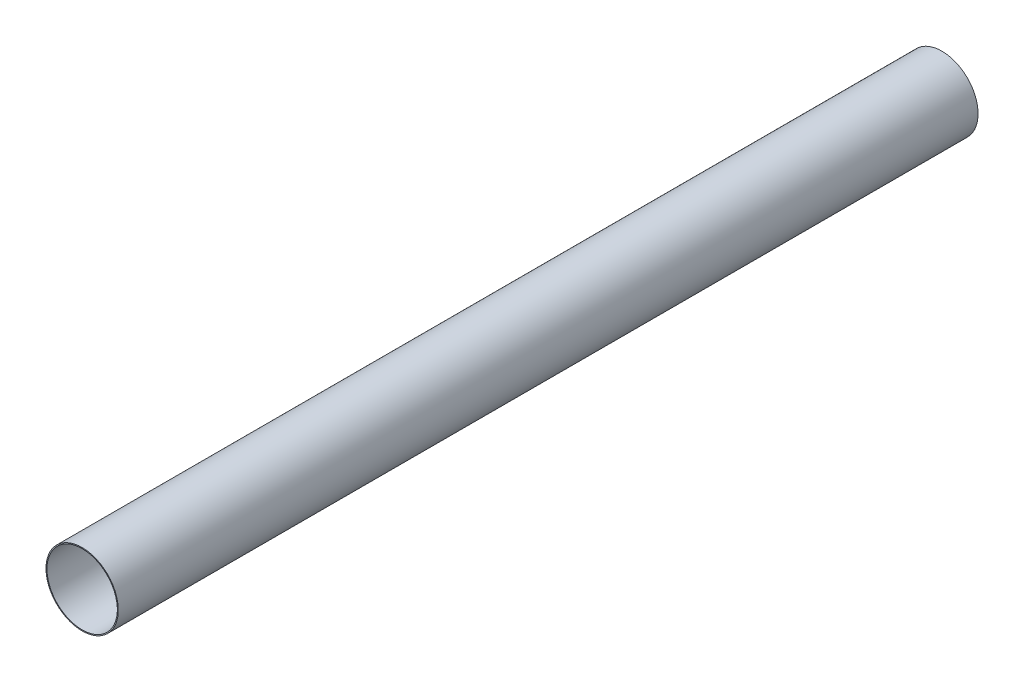
ISO-10303-21;
HEADER;
FILE_DESCRIPTION(('STEP AP214'),'2;1');
FILE_NAME('part.step','',(''),(''),'','','');
FILE_SCHEMA(('AUTOMOTIVE_DESIGN { 1 0 10303 214 1 1 1 1 }'));
ENDSEC;
DATA;
#1=APPLICATION_CONTEXT('core data for automotive mechanical design processes');
#2=APPLICATION_PROTOCOL_DEFINITION('international standard','automotive_design',2000,#1);
#3=PRODUCT_CONTEXT('',#1,'mechanical');
#4=PRODUCT('Part','Part','',(#3));
#5=PRODUCT_RELATED_PRODUCT_CATEGORY('part','',(#4));
#6=PRODUCT_DEFINITION_FORMATION('','',#4);
#7=PRODUCT_DEFINITION_CONTEXT('part definition',#1,'design');
#8=PRODUCT_DEFINITION('design','',#6,#7);
#9=PRODUCT_DEFINITION_SHAPE('','',#8);
#10=(LENGTH_UNIT() NAMED_UNIT(*) SI_UNIT(.MILLI.,.METRE.));
#11=(NAMED_UNIT(*) PLANE_ANGLE_UNIT() SI_UNIT($,.RADIAN.));
#12=(NAMED_UNIT(*) SI_UNIT($,.STERADIAN.) SOLID_ANGLE_UNIT());
#13=UNCERTAINTY_MEASURE_WITH_UNIT(LENGTH_MEASURE(1.E-05),#10,'distance_accuracy_value','');
#14=(GEOMETRIC_REPRESENTATION_CONTEXT(3) GLOBAL_UNCERTAINTY_ASSIGNED_CONTEXT((#13)) GLOBAL_UNIT_ASSIGNED_CONTEXT((#10,
#11,#12)) REPRESENTATION_CONTEXT('',''));
#15=CARTESIAN_POINT('',(0.,0.,0.));
#16=DIRECTION('',(0.,0.,1.));
#17=DIRECTION('',(1.,0.,0.));
#18=AXIS2_PLACEMENT_3D('',#15,#16,#17);
#19=CARTESIAN_POINT('',(0.,0.,1784.));
#20=DIRECTION('',(0.,0.,1.));
#21=DIRECTION('',(1.,0.,0.));
#22=AXIS2_PLACEMENT_3D('',#19,#20,#21);
#23=PLANE('',#22);
#24=CARTESIAN_POINT('',(0.,0.,1784.));
#25=DIRECTION('',(0.,0.,1.));
#26=DIRECTION('',(1.,0.,0.));
#27=AXIS2_PLACEMENT_3D('',#24,#25,#26);
#28=CIRCLE('',#27,75.);
#29=CARTESIAN_POINT('',(-75.,0.,1784.));
#30=VERTEX_POINT('',#29);
#31=EDGE_CURVE('E10',#30,#30,#28,.T.);
#32=ORIENTED_EDGE('',*,*,#31,.T.);
#33=EDGE_LOOP('',(#32));
#34=FACE_BOUND('',#33,.T.);
#35=CARTESIAN_POINT('',(0.,0.,1784.));
#36=DIRECTION('',(0.,0.,1.));
#37=DIRECTION('',(1.,0.,0.));
#38=AXIS2_PLACEMENT_3D('',#35,#36,#37);
#39=CIRCLE('',#38,73.);
#40=CARTESIAN_POINT('',(-73.,0.,1784.));
#41=VERTEX_POINT('',#40);
#42=EDGE_CURVE('E45',#41,#41,#39,.T.);
#43=ORIENTED_EDGE('',*,*,#42,.F.);
#44=EDGE_LOOP('',(#43));
#45=FACE_BOUND('',#44,.T.);
#46=ADVANCED_FACE('F34',(#34,#45),#23,.T.);
#47=CARTESIAN_POINT('',(0.,0.,0.));
#48=DIRECTION('',(0.,0.,1.));
#49=DIRECTION('',(1.,0.,0.));
#50=AXIS2_PLACEMENT_3D('',#47,#48,#49);
#51=PLANE('',#50);
#52=CARTESIAN_POINT('',(0.,0.,0.));
#53=DIRECTION('',(0.,0.,1.));
#54=DIRECTION('',(1.,0.,0.));
#55=AXIS2_PLACEMENT_3D('',#52,#53,#54);
#56=CIRCLE('',#55,75.);
#57=CARTESIAN_POINT('',(-75.,0.,0.));
#58=VERTEX_POINT('',#57);
#59=EDGE_CURVE('E38',#58,#58,#56,.T.);
#60=ORIENTED_EDGE('',*,*,#59,.F.);
#61=EDGE_LOOP('',(#60));
#62=FACE_BOUND('',#61,.T.);
#63=CARTESIAN_POINT('',(0.,0.,0.));
#64=DIRECTION('',(0.,0.,1.));
#65=DIRECTION('',(1.,0.,0.));
#66=AXIS2_PLACEMENT_3D('',#63,#64,#65);
#67=CIRCLE('',#66,73.);
#68=CARTESIAN_POINT('',(-73.,0.,0.));
#69=VERTEX_POINT('',#68);
#70=EDGE_CURVE('E47',#69,#69,#67,.T.);
#71=ORIENTED_EDGE('',*,*,#70,.T.);
#72=EDGE_LOOP('',(#71));
#73=FACE_BOUND('',#72,.T.);
#74=ADVANCED_FACE('F57',(#62,#73),#51,.F.);
#75=CARTESIAN_POINT('',(0.,0.,1784.));
#76=DIRECTION('',(0.,0.,-1.));
#77=DIRECTION('',(-1.,0.,0.));
#78=AXIS2_PLACEMENT_3D('',#75,#76,#77);
#79=CYLINDRICAL_SURFACE('',#78,75.);
#80=CARTESIAN_POINT('',(-75.,0.,1784.));
#81=CARTESIAN_POINT('',(-75.,0.,1765.41666666667));
#82=CARTESIAN_POINT('',(-75.,0.,1746.83333333333));
#83=CARTESIAN_POINT('',(-75.,0.,1709.66666666667));
#84=CARTESIAN_POINT('',(-75.,0.,1691.08333333333));
#85=CARTESIAN_POINT('',(-75.,0.,1653.91666666667));
#86=CARTESIAN_POINT('',(-75.,0.,1635.33333333333));
#87=CARTESIAN_POINT('',(-75.,0.,1598.16666666667));
#88=CARTESIAN_POINT('',(-75.,0.,1579.58333333333));
#89=CARTESIAN_POINT('',(-75.,0.,1542.41666666667));
#90=CARTESIAN_POINT('',(-75.,0.,1523.83333333333));
#91=CARTESIAN_POINT('',(-75.,0.,1486.66666666667));
#92=CARTESIAN_POINT('',(-75.,0.,1468.08333333333));
#93=CARTESIAN_POINT('',(-75.,0.,1430.91666666667));
#94=CARTESIAN_POINT('',(-75.,0.,1412.33333333333));
#95=CARTESIAN_POINT('',(-75.,0.,1375.16666666667));
#96=CARTESIAN_POINT('',(-75.,0.,1356.58333333333));
#97=CARTESIAN_POINT('',(-75.,0.,1319.41666666667));
#98=CARTESIAN_POINT('',(-75.,0.,1300.83333333333));
#99=CARTESIAN_POINT('',(-75.,0.,1263.66666666667));
#100=CARTESIAN_POINT('',(-75.,0.,1245.08333333333));
#101=CARTESIAN_POINT('',(-75.,0.,1207.91666666667));
#102=CARTESIAN_POINT('',(-75.,0.,1189.33333333333));
#103=CARTESIAN_POINT('',(-75.,0.,1152.16666666667));
#104=CARTESIAN_POINT('',(-75.,0.,1133.58333333333));
#105=CARTESIAN_POINT('',(-75.,0.,1096.41666666667));
#106=CARTESIAN_POINT('',(-75.,0.,1077.83333333333));
#107=CARTESIAN_POINT('',(-75.,0.,1040.66666666667));
#108=CARTESIAN_POINT('',(-75.,0.,1022.08333333333));
#109=CARTESIAN_POINT('',(-75.,0.,984.916666666667));
#110=CARTESIAN_POINT('',(-75.,0.,966.333333333333));
#111=CARTESIAN_POINT('',(-75.,0.,929.166666666667));
#112=CARTESIAN_POINT('',(-75.,0.,910.583333333333));
#113=CARTESIAN_POINT('',(-75.,0.,873.416666666667));
#114=CARTESIAN_POINT('',(-75.,0.,854.833333333333));
#115=CARTESIAN_POINT('',(-75.,0.,817.666666666667));
#116=CARTESIAN_POINT('',(-75.,0.,799.083333333333));
#117=CARTESIAN_POINT('',(-75.,0.,761.916666666667));
#118=CARTESIAN_POINT('',(-75.,0.,743.333333333333));
#119=CARTESIAN_POINT('',(-75.,0.,706.166666666667));
#120=CARTESIAN_POINT('',(-75.,0.,687.583333333333));
#121=CARTESIAN_POINT('',(-75.,0.,650.416666666667));
#122=CARTESIAN_POINT('',(-75.,0.,631.833333333333));
#123=CARTESIAN_POINT('',(-75.,0.,594.666666666667));
#124=CARTESIAN_POINT('',(-75.,0.,576.083333333333));
#125=CARTESIAN_POINT('',(-75.,0.,538.916666666667));
#126=CARTESIAN_POINT('',(-75.,0.,520.333333333333));
#127=CARTESIAN_POINT('',(-75.,0.,483.166666666667));
#128=CARTESIAN_POINT('',(-75.,0.,464.583333333334));
#129=CARTESIAN_POINT('',(-75.,0.,427.416666666667));
#130=CARTESIAN_POINT('',(-75.,0.,408.833333333333));
#131=CARTESIAN_POINT('',(-75.,0.,371.666666666667));
#132=CARTESIAN_POINT('',(-75.,0.,353.083333333333));
#133=CARTESIAN_POINT('',(-75.,0.,315.916666666667));
#134=CARTESIAN_POINT('',(-75.,0.,297.333333333333));
#135=CARTESIAN_POINT('',(-75.,0.,260.166666666667));
#136=CARTESIAN_POINT('',(-75.,0.,241.583333333333));
#137=CARTESIAN_POINT('',(-75.,0.,204.416666666667));
#138=CARTESIAN_POINT('',(-75.,0.,185.833333333333));
#139=CARTESIAN_POINT('',(-75.,0.,148.666666666667));
#140=CARTESIAN_POINT('',(-75.,0.,130.083333333333));
#141=CARTESIAN_POINT('',(-75.,0.,92.9166666666666));
#142=CARTESIAN_POINT('',(-75.,0.,74.3333333333333));
#143=CARTESIAN_POINT('',(-75.,0.,37.1666666666666));
#144=CARTESIAN_POINT('',(-75.,0.,18.5833333333333));
#145=CARTESIAN_POINT('',(-75.,0.,0.));
#146=B_SPLINE_CURVE_WITH_KNOTS('',3,(#80,#81,#82,#83,#84,#85,#86,#87,#88,#89,#90,#91,#92,#93,
#94,#95,#96,#97,#98,#99,#100,#101,#102,#103,#104,#105,#106,#107,#108,#109,#110,#111,#112,#113,
#114,#115,#116,#117,#118,#119,#120,#121,#122,#123,#124,#125,#126,#127,#128,#129,#130,#131,#132,
#133,#134,#135,#136,#137,#138,#139,#140,#141,#142,#143,#144,#145),.UNSPECIFIED.,.F.,.F.,(4,2,2,
2,2,2,2,2,2,2,2,2,2,2,2,2,2,2,2,2,2,2,2,2,2,2,2,2,2,2,2,2,4),(0.,55.7500000000002,111.5,167.25,
223.,278.75,334.5,390.25,446.,501.75,557.5,613.25,669.,724.75,780.5,836.25,892.,947.75,1003.5,
1059.25,1115.,1170.75,1226.5,1282.25,1338.,1393.75,1449.5,1505.25,1561.,1616.75,1672.5,1728.25,
1784.),.UNSPECIFIED.);
#147=EDGE_CURVE('BSEAM36',#30,#58,#146,.T.);
#148=ORIENTED_EDGE('',*,*,#31,.F.);
#149=ORIENTED_EDGE('',*,*,#59,.T.);
#150=ORIENTED_EDGE('',*,*,#147,.T.);
#151=ORIENTED_EDGE('',*,*,#147,.F.);
#152=EDGE_LOOP('',(#148,#150,#149,#151));
#153=FACE_BOUND('',#152,.T.);
#154=ADVANCED_FACE('F36',(#153),#79,.T.);
#155=CARTESIAN_POINT('',(0.,0.,1784.));
#156=DIRECTION('',(0.,0.,-1.));
#157=DIRECTION('',(-1.,0.,0.));
#158=AXIS2_PLACEMENT_3D('',#155,#156,#157);
#159=CYLINDRICAL_SURFACE('',#158,73.);
#160=CARTESIAN_POINT('',(-73.,0.,1784.));
#161=CARTESIAN_POINT('',(-73.,0.,1765.41666666667));
#162=CARTESIAN_POINT('',(-73.,0.,1746.83333333333));
#163=CARTESIAN_POINT('',(-73.,0.,1709.66666666667));
#164=CARTESIAN_POINT('',(-73.,0.,1691.08333333333));
#165=CARTESIAN_POINT('',(-73.,0.,1653.91666666667));
#166=CARTESIAN_POINT('',(-73.,0.,1635.33333333333));
#167=CARTESIAN_POINT('',(-73.,0.,1598.16666666667));
#168=CARTESIAN_POINT('',(-73.,0.,1579.58333333333));
#169=CARTESIAN_POINT('',(-73.,0.,1542.41666666667));
#170=CARTESIAN_POINT('',(-73.,0.,1523.83333333333));
#171=CARTESIAN_POINT('',(-73.,0.,1486.66666666667));
#172=CARTESIAN_POINT('',(-73.,0.,1468.08333333333));
#173=CARTESIAN_POINT('',(-73.,0.,1430.91666666667));
#174=CARTESIAN_POINT('',(-73.,0.,1412.33333333333));
#175=CARTESIAN_POINT('',(-73.,0.,1375.16666666667));
#176=CARTESIAN_POINT('',(-73.,0.,1356.58333333333));
#177=CARTESIAN_POINT('',(-73.,0.,1319.41666666667));
#178=CARTESIAN_POINT('',(-73.,0.,1300.83333333333));
#179=CARTESIAN_POINT('',(-73.,0.,1263.66666666667));
#180=CARTESIAN_POINT('',(-73.,0.,1245.08333333333));
#181=CARTESIAN_POINT('',(-73.,0.,1207.91666666667));
#182=CARTESIAN_POINT('',(-73.,0.,1189.33333333333));
#183=CARTESIAN_POINT('',(-73.,0.,1152.16666666667));
#184=CARTESIAN_POINT('',(-73.,0.,1133.58333333333));
#185=CARTESIAN_POINT('',(-73.,0.,1096.41666666667));
#186=CARTESIAN_POINT('',(-73.,0.,1077.83333333333));
#187=CARTESIAN_POINT('',(-73.,0.,1040.66666666667));
#188=CARTESIAN_POINT('',(-73.,0.,1022.08333333333));
#189=CARTESIAN_POINT('',(-73.,0.,984.916666666667));
#190=CARTESIAN_POINT('',(-73.,0.,966.333333333333));
#191=CARTESIAN_POINT('',(-73.,0.,929.166666666667));
#192=CARTESIAN_POINT('',(-73.,0.,910.583333333333));
#193=CARTESIAN_POINT('',(-73.,0.,873.416666666667));
#194=CARTESIAN_POINT('',(-73.,0.,854.833333333333));
#195=CARTESIAN_POINT('',(-73.,0.,817.666666666667));
#196=CARTESIAN_POINT('',(-73.,0.,799.083333333333));
#197=CARTESIAN_POINT('',(-73.,0.,761.916666666667));
#198=CARTESIAN_POINT('',(-73.,0.,743.333333333333));
#199=CARTESIAN_POINT('',(-73.,0.,706.166666666667));
#200=CARTESIAN_POINT('',(-73.,0.,687.583333333333));
#201=CARTESIAN_POINT('',(-73.,0.,650.416666666667));
#202=CARTESIAN_POINT('',(-73.,0.,631.833333333333));
#203=CARTESIAN_POINT('',(-73.,0.,594.666666666667));
#204=CARTESIAN_POINT('',(-73.,0.,576.083333333333));
#205=CARTESIAN_POINT('',(-73.,0.,538.916666666667));
#206=CARTESIAN_POINT('',(-73.,0.,520.333333333333));
#207=CARTESIAN_POINT('',(-73.,0.,483.166666666667));
#208=CARTESIAN_POINT('',(-73.,0.,464.583333333333));
#209=CARTESIAN_POINT('',(-73.,0.,427.416666666667));
#210=CARTESIAN_POINT('',(-73.,0.,408.833333333333));
#211=CARTESIAN_POINT('',(-73.,0.,371.666666666667));
#212=CARTESIAN_POINT('',(-73.,0.,353.083333333333));
#213=CARTESIAN_POINT('',(-73.,0.,315.916666666667));
#214=CARTESIAN_POINT('',(-73.,0.,297.333333333333));
#215=CARTESIAN_POINT('',(-73.,0.,260.166666666667));
#216=CARTESIAN_POINT('',(-73.,0.,241.583333333333));
#217=CARTESIAN_POINT('',(-73.,0.,204.416666666667));
#218=CARTESIAN_POINT('',(-73.,0.,185.833333333333));
#219=CARTESIAN_POINT('',(-73.,0.,148.666666666667));
#220=CARTESIAN_POINT('',(-73.,0.,130.083333333333));
#221=CARTESIAN_POINT('',(-73.,0.,92.9166666666666));
#222=CARTESIAN_POINT('',(-73.,0.,74.3333333333333));
#223=CARTESIAN_POINT('',(-73.,0.,37.1666666666666));
#224=CARTESIAN_POINT('',(-73.,0.,18.5833333333333));
#225=CARTESIAN_POINT('',(-73.,0.,0.));
#226=B_SPLINE_CURVE_WITH_KNOTS('',3,(#160,#161,#162,#163,#164,#165,#166,#167,#168,#169,#170,
#171,#172,#173,#174,#175,#176,#177,#178,#179,#180,#181,#182,#183,#184,#185,#186,#187,#188,#189,
#190,#191,#192,#193,#194,#195,#196,#197,#198,#199,#200,#201,#202,#203,#204,#205,#206,#207,#208,
#209,#210,#211,#212,#213,#214,#215,#216,#217,#218,#219,#220,#221,#222,#223,#224,#225),
.UNSPECIFIED.,.F.,.F.,(4,2,2,2,2,2,2,2,2,2,2,2,2,2,2,2,2,2,2,2,2,2,2,2,2,2,2,2,2,2,2,2,4),(0.,
55.75,111.5,167.25,223.,278.75,334.5,390.25,446.,501.75,557.5,613.25,669.,724.75,780.5,836.25,
892.,947.75,1003.5,1059.25,1115.,1170.75,1226.5,1282.25,1338.,1393.75,1449.5,1505.25,1561.,
1616.75,1672.5,1728.25,1784.),.UNSPECIFIED.);
#227=EDGE_CURVE('BSEAM53',#41,#69,#226,.T.);
#228=ORIENTED_EDGE('',*,*,#42,.T.);
#229=ORIENTED_EDGE('',*,*,#70,.F.);
#230=ORIENTED_EDGE('',*,*,#227,.T.);
#231=ORIENTED_EDGE('',*,*,#227,.F.);
#232=EDGE_LOOP('',(#228,#230,#229,#231));
#233=FACE_BOUND('',#232,.T.);
#234=ADVANCED_FACE('F53',(#233),#159,.F.);
#235=CLOSED_SHELL('',(#46,#74,#154,#234));
#236=MANIFOLD_SOLID_BREP('B2',#235);
#237=ADVANCED_BREP_SHAPE_REPRESENTATION('',(#18,#236),#14);
#238=SHAPE_DEFINITION_REPRESENTATION(#9,#237);
ENDSEC;
END-ISO-10303-21;
